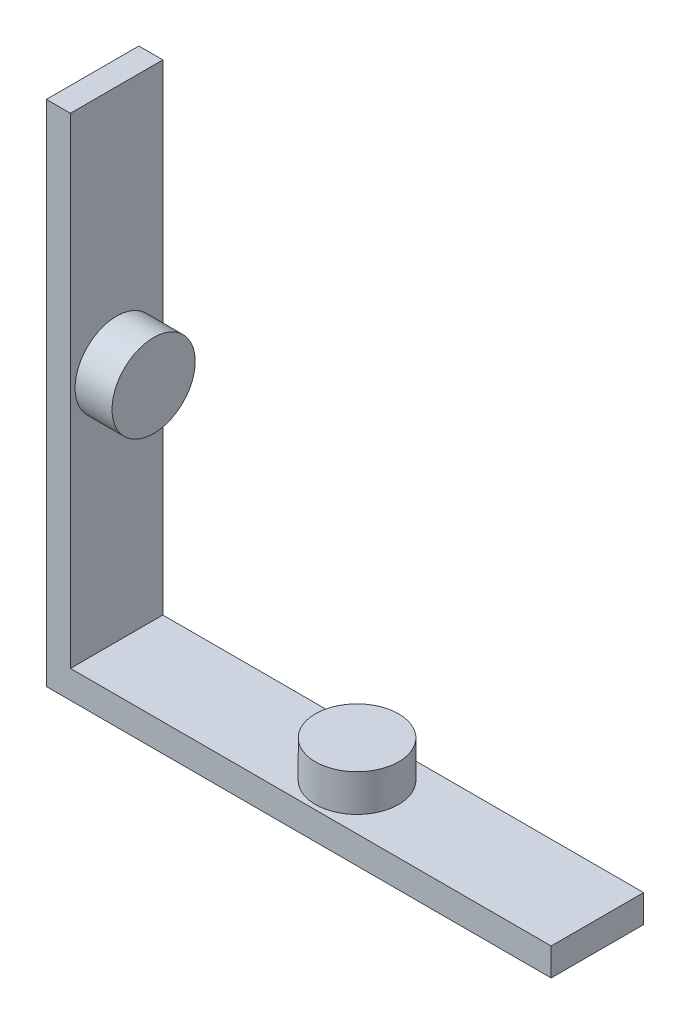
ISO-10303-21;
HEADER;
FILE_DESCRIPTION(('STEP AP214'),'2;1');
FILE_NAME('part.step','',(''),(''),'','','');
FILE_SCHEMA(('AUTOMOTIVE_DESIGN { 1 0 10303 214 1 1 1 1 }'));
ENDSEC;
DATA;
#1=APPLICATION_CONTEXT('core data for automotive mechanical design processes');
#2=APPLICATION_PROTOCOL_DEFINITION('international standard','automotive_design',2000,#1);
#3=PRODUCT_CONTEXT('',#1,'mechanical');
#4=PRODUCT('Part','Part','',(#3));
#5=PRODUCT_RELATED_PRODUCT_CATEGORY('part','',(#4));
#6=PRODUCT_DEFINITION_FORMATION('','',#4);
#7=PRODUCT_DEFINITION_CONTEXT('part definition',#1,'design');
#8=PRODUCT_DEFINITION('design','',#6,#7);
#9=PRODUCT_DEFINITION_SHAPE('','',#8);
#10=(LENGTH_UNIT() NAMED_UNIT(*) SI_UNIT(.MILLI.,.METRE.));
#11=(NAMED_UNIT(*) PLANE_ANGLE_UNIT() SI_UNIT($,.RADIAN.));
#12=(NAMED_UNIT(*) SI_UNIT($,.STERADIAN.) SOLID_ANGLE_UNIT());
#13=UNCERTAINTY_MEASURE_WITH_UNIT(LENGTH_MEASURE(1.E-05),#10,'distance_accuracy_value','');
#14=(GEOMETRIC_REPRESENTATION_CONTEXT(3) GLOBAL_UNCERTAINTY_ASSIGNED_CONTEXT((#13)) GLOBAL_UNIT_ASSIGNED_CONTEXT((#10,
#11,#12)) REPRESENTATION_CONTEXT('',''));
#15=CARTESIAN_POINT('',(0.,0.,0.));
#16=DIRECTION('',(0.,0.,1.));
#17=DIRECTION('',(1.,0.,0.));
#18=AXIS2_PLACEMENT_3D('',#15,#16,#17);
#19=CARTESIAN_POINT('',(15.,275.,50.));
#20=DIRECTION('',(0.,-1.,0.));
#21=DIRECTION('',(0.,0.,-1.));
#22=AXIS2_PLACEMENT_3D('',#19,#20,#21);
#23=PLANE('',#22);
#24=DIRECTION('',(-1.,0.,0.));
#25=VECTOR('',#24,1.);
#26=CARTESIAN_POINT('',(15.,275.,0.));
#27=LINE('',#26,#25);
#28=CARTESIAN_POINT('',(15.,275.,0.));
#29=VERTEX_POINT('',#28);
#30=CARTESIAN_POINT('',(2.00000000000006,275.,0.));
#31=VERTEX_POINT('',#30);
#32=EDGE_CURVE('E131',#29,#31,#27,.T.);
#33=ORIENTED_EDGE('',*,*,#32,.T.);
#34=DIRECTION('',(0.,0.,1.));
#35=VECTOR('',#34,1.);
#36=CARTESIAN_POINT('',(2.00000000000006,275.,50.));
#37=LINE('',#36,#35);
#38=CARTESIAN_POINT('',(2.00000000000006,275.,50.));
#39=VERTEX_POINT('',#38);
#40=EDGE_CURVE('E60',#31,#39,#37,.T.);
#41=ORIENTED_EDGE('',*,*,#40,.T.);
#42=DIRECTION('',(-1.,0.,0.));
#43=VECTOR('',#42,1.);
#44=CARTESIAN_POINT('',(15.,275.,50.));
#45=LINE('',#44,#43);
#46=CARTESIAN_POINT('',(15.,275.,50.));
#47=VERTEX_POINT('',#46);
#48=EDGE_CURVE('E108',#47,#39,#45,.T.);
#49=ORIENTED_EDGE('',*,*,#48,.F.);
#50=DIRECTION('',(0.,0.,-1.));
#51=VECTOR('',#50,1.);
#52=CARTESIAN_POINT('',(15.,275.,50.));
#53=LINE('',#52,#51);
#54=EDGE_CURVE('E130',#47,#29,#53,.T.);
#55=ORIENTED_EDGE('',*,*,#54,.T.);
#56=EDGE_LOOP('',(#33,#41,#49,#55));
#57=FACE_BOUND('',#56,.T.);
#58=ADVANCED_FACE('F35',(#57),#23,.F.);
#59=CARTESIAN_POINT('',(0.,275.,50.));
#60=DIRECTION('',(1.,0.,0.));
#61=DIRECTION('',(0.,1.,0.));
#62=AXIS2_PLACEMENT_3D('',#59,#60,#61);
#63=PLANE('',#62);
#64=DIRECTION('',(0.,0.,-1.));
#65=VECTOR('',#64,1.);
#66=CARTESIAN_POINT('',(0.,273.,50.));
#67=LINE('',#66,#65);
#68=CARTESIAN_POINT('',(0.,273.,48.));
#69=VERTEX_POINT('',#68);
#70=CARTESIAN_POINT('',(0.,273.,2.));
#71=VERTEX_POINT('',#70);
#72=EDGE_CURVE('E156',#69,#71,#67,.T.);
#73=ORIENTED_EDGE('',*,*,#72,.T.);
#74=DIRECTION('',(0.,-1.,0.));
#75=VECTOR('',#74,1.);
#76=CARTESIAN_POINT('',(0.,275.,2.));
#77=LINE('',#76,#75);
#78=CARTESIAN_POINT('',(0.,2.,2.));
#79=VERTEX_POINT('',#78);
#80=EDGE_CURVE('E158',#71,#79,#77,.T.);
#81=ORIENTED_EDGE('',*,*,#80,.T.);
#82=DIRECTION('',(0.,0.,1.));
#83=VECTOR('',#82,1.);
#84=CARTESIAN_POINT('',(0.,2.,50.));
#85=LINE('',#84,#83);
#86=CARTESIAN_POINT('',(0.,2.,48.));
#87=VERTEX_POINT('',#86);
#88=EDGE_CURVE('E152',#79,#87,#85,.T.);
#89=ORIENTED_EDGE('',*,*,#88,.T.);
#90=DIRECTION('',(0.,1.,0.));
#91=VECTOR('',#90,1.);
#92=CARTESIAN_POINT('',(0.,275.,48.));
#93=LINE('',#92,#91);
#94=EDGE_CURVE('E154',#87,#69,#93,.T.);
#95=ORIENTED_EDGE('',*,*,#94,.T.);
#96=EDGE_LOOP('',(#73,#81,#89,#95));
#97=FACE_BOUND('',#96,.T.);
#98=ADVANCED_FACE('F210',(#97),#63,.F.);
#99=CARTESIAN_POINT('',(0.,0.,50.));
#100=DIRECTION('',(0.,1.,0.));
#101=DIRECTION('',(0.,0.,1.));
#102=AXIS2_PLACEMENT_3D('',#99,#100,#101);
#103=PLANE('',#102);
#104=DIRECTION('',(1.,0.,0.));
#105=VECTOR('',#104,1.);
#106=CARTESIAN_POINT('',(0.,0.,50.));
#107=LINE('',#106,#105);
#108=CARTESIAN_POINT('',(2.00000000000006,0.,50.));
#109=VERTEX_POINT('',#108);
#110=CARTESIAN_POINT('',(275.,0.,50.));
#111=VERTEX_POINT('',#110);
#112=EDGE_CURVE('E100',#109,#111,#107,.T.);
#113=ORIENTED_EDGE('',*,*,#112,.F.);
#114=DIRECTION('',(0.,0.,-1.));
#115=VECTOR('',#114,1.);
#116=CARTESIAN_POINT('',(2.00000000000006,0.,50.));
#117=LINE('',#116,#115);
#118=CARTESIAN_POINT('',(2.00000000000006,0.,0.));
#119=VERTEX_POINT('',#118);
#120=EDGE_CURVE('E11',#109,#119,#117,.T.);
#121=ORIENTED_EDGE('',*,*,#120,.T.);
#122=DIRECTION('',(1.,0.,0.));
#123=VECTOR('',#122,1.);
#124=CARTESIAN_POINT('',(0.,0.,0.));
#125=LINE('',#124,#123);
#126=CARTESIAN_POINT('',(275.,0.,0.));
#127=VERTEX_POINT('',#126);
#128=EDGE_CURVE('E114',#119,#127,#125,.T.);
#129=ORIENTED_EDGE('',*,*,#128,.T.);
#130=DIRECTION('',(0.,0.,-1.));
#131=VECTOR('',#130,1.);
#132=CARTESIAN_POINT('',(275.,0.,50.));
#133=LINE('',#132,#131);
#134=EDGE_CURVE('E111',#111,#127,#133,.T.);
#135=ORIENTED_EDGE('',*,*,#134,.F.);
#136=EDGE_LOOP('',(#113,#121,#129,#135));
#137=FACE_BOUND('',#136,.T.);
#138=ADVANCED_FACE('F112',(#137),#103,.F.);
#139=CARTESIAN_POINT('',(275.,0.,50.));
#140=DIRECTION('',(-1.,0.,0.));
#141=DIRECTION('',(0.,0.,1.));
#142=AXIS2_PLACEMENT_3D('',#139,#140,#141);
#143=PLANE('',#142);
#144=DIRECTION('',(0.,1.,0.));
#145=VECTOR('',#144,1.);
#146=CARTESIAN_POINT('',(275.,0.,0.));
#147=LINE('',#146,#145);
#148=CARTESIAN_POINT('',(275.,15.,0.));
#149=VERTEX_POINT('',#148);
#150=EDGE_CURVE('E135',#127,#149,#147,.T.);
#151=ORIENTED_EDGE('',*,*,#150,.T.);
#152=DIRECTION('',(0.,0.,-1.));
#153=VECTOR('',#152,1.);
#154=CARTESIAN_POINT('',(275.,15.,50.));
#155=LINE('',#154,#153);
#156=CARTESIAN_POINT('',(275.,15.,50.));
#157=VERTEX_POINT('',#156);
#158=EDGE_CURVE('E118',#157,#149,#155,.T.);
#159=ORIENTED_EDGE('',*,*,#158,.F.);
#160=DIRECTION('',(0.,1.,0.));
#161=VECTOR('',#160,1.);
#162=CARTESIAN_POINT('',(275.,0.,50.));
#163=LINE('',#162,#161);
#164=EDGE_CURVE('E104',#111,#157,#163,.T.);
#165=ORIENTED_EDGE('',*,*,#164,.F.);
#166=ORIENTED_EDGE('',*,*,#134,.T.);
#167=EDGE_LOOP('',(#151,#159,#165,#166));
#168=FACE_BOUND('',#167,.T.);
#169=ADVANCED_FACE('F120',(#168),#143,.F.);
#170=CARTESIAN_POINT('',(275.,15.,50.));
#171=DIRECTION('',(0.,-1.,0.));
#172=DIRECTION('',(1.,0.,0.));
#173=AXIS2_PLACEMENT_3D('',#170,#171,#172);
#174=PLANE('',#173);
#175=CARTESIAN_POINT('',(145.,15.,25.));
#176=DIRECTION('',(0.,-1.,0.));
#177=DIRECTION('',(1.,0.,0.));
#178=AXIS2_PLACEMENT_3D('',#175,#176,#177);
#179=CIRCLE('',#178,22.5);
#180=CARTESIAN_POINT('',(167.5,15.,25.));
#181=VERTEX_POINT('',#180);
#182=EDGE_CURVE('E117',#181,#181,#179,.F.);
#183=ORIENTED_EDGE('',*,*,#182,.F.);
#184=EDGE_LOOP('',(#183));
#185=FACE_BOUND('',#184,.T.);
#186=DIRECTION('',(-1.,0.,0.));
#187=VECTOR('',#186,1.);
#188=CARTESIAN_POINT('',(275.,15.,0.));
#189=LINE('',#188,#187);
#190=CARTESIAN_POINT('',(15.,15.,0.));
#191=VERTEX_POINT('',#190);
#192=EDGE_CURVE('E137',#149,#191,#189,.T.);
#193=ORIENTED_EDGE('',*,*,#192,.T.);
#194=DIRECTION('',(0.,0.,-1.));
#195=VECTOR('',#194,1.);
#196=CARTESIAN_POINT('',(15.,15.,50.));
#197=LINE('',#196,#195);
#198=CARTESIAN_POINT('',(15.,15.,50.));
#199=VERTEX_POINT('',#198);
#200=EDGE_CURVE('E143',#199,#191,#197,.T.);
#201=ORIENTED_EDGE('',*,*,#200,.F.);
#202=DIRECTION('',(-1.,0.,0.));
#203=VECTOR('',#202,1.);
#204=CARTESIAN_POINT('',(275.,15.,50.));
#205=LINE('',#204,#203);
#206=EDGE_CURVE('E123',#157,#199,#205,.T.);
#207=ORIENTED_EDGE('',*,*,#206,.F.);
#208=ORIENTED_EDGE('',*,*,#158,.T.);
#209=EDGE_LOOP('',(#193,#201,#207,#208));
#210=FACE_BOUND('',#209,.T.);
#211=ADVANCED_FACE('F315',(#185,#210),#174,.F.);
#212=CARTESIAN_POINT('',(15.,15.,50.));
#213=DIRECTION('',(-1.,0.,0.));
#214=DIRECTION('',(0.,0.,1.));
#215=AXIS2_PLACEMENT_3D('',#212,#213,#214);
#216=PLANE('',#215);
#217=CARTESIAN_POINT('',(15.,145.,25.));
#218=DIRECTION('',(-1.,0.,0.));
#219=DIRECTION('',(0.,0.,1.));
#220=AXIS2_PLACEMENT_3D('',#217,#218,#219);
#221=CIRCLE('',#220,22.5);
#222=CARTESIAN_POINT('',(15.,145.,47.5));
#223=VERTEX_POINT('',#222);
#224=EDGE_CURVE('E149',#223,#223,#221,.F.);
#225=ORIENTED_EDGE('',*,*,#224,.F.);
#226=EDGE_LOOP('',(#225));
#227=FACE_BOUND('',#226,.T.);
#228=DIRECTION('',(0.,1.,0.));
#229=VECTOR('',#228,1.);
#230=CARTESIAN_POINT('',(15.,15.,0.));
#231=LINE('',#230,#229);
#232=EDGE_CURVE('E139',#191,#29,#231,.T.);
#233=ORIENTED_EDGE('',*,*,#232,.T.);
#234=ORIENTED_EDGE('',*,*,#54,.F.);
#235=DIRECTION('',(0.,1.,0.));
#236=VECTOR('',#235,1.);
#237=CARTESIAN_POINT('',(15.,15.,50.));
#238=LINE('',#237,#236);
#239=EDGE_CURVE('E125',#199,#47,#238,.T.);
#240=ORIENTED_EDGE('',*,*,#239,.F.);
#241=ORIENTED_EDGE('',*,*,#200,.T.);
#242=EDGE_LOOP('',(#233,#234,#240,#241));
#243=FACE_BOUND('',#242,.T.);
#244=ADVANCED_FACE('F268',(#227,#243),#216,.F.);
#245=CARTESIAN_POINT('',(0.,0.,50.));
#246=DIRECTION('',(0.,0.,1.));
#247=DIRECTION('',(1.,0.,0.));
#248=AXIS2_PLACEMENT_3D('',#245,#246,#247);
#249=PLANE('',#248);
#250=ORIENTED_EDGE('',*,*,#48,.T.);
#251=DIRECTION('',(0.,-1.,0.));
#252=VECTOR('',#251,1.);
#253=CARTESIAN_POINT('',(2.00000000000006,0.,50.));
#254=LINE('',#253,#252);
#255=EDGE_CURVE('E45',#39,#109,#254,.T.);
#256=ORIENTED_EDGE('',*,*,#255,.T.);
#257=ORIENTED_EDGE('',*,*,#112,.T.);
#258=ORIENTED_EDGE('',*,*,#164,.T.);
#259=ORIENTED_EDGE('',*,*,#206,.T.);
#260=ORIENTED_EDGE('',*,*,#239,.T.);
#261=EDGE_LOOP('',(#250,#256,#257,#258,#259,#260));
#262=FACE_BOUND('',#261,.T.);
#263=ADVANCED_FACE('F102',(#262),#249,.T.);
#264=CARTESIAN_POINT('',(0.,0.,0.));
#265=DIRECTION('',(0.,0.,1.));
#266=DIRECTION('',(1.,0.,0.));
#267=AXIS2_PLACEMENT_3D('',#264,#265,#266);
#268=PLANE('',#267);
#269=ORIENTED_EDGE('',*,*,#128,.F.);
#270=DIRECTION('',(0.,1.,0.));
#271=VECTOR('',#270,1.);
#272=CARTESIAN_POINT('',(2.00000000000006,0.,0.));
#273=LINE('',#272,#271);
#274=EDGE_CURVE('E161',#119,#31,#273,.T.);
#275=ORIENTED_EDGE('',*,*,#274,.T.);
#276=ORIENTED_EDGE('',*,*,#32,.F.);
#277=ORIENTED_EDGE('',*,*,#232,.F.);
#278=ORIENTED_EDGE('',*,*,#192,.F.);
#279=ORIENTED_EDGE('',*,*,#150,.F.);
#280=EDGE_LOOP('',(#269,#275,#276,#277,#278,#279));
#281=FACE_BOUND('',#280,.T.);
#282=ADVANCED_FACE('F193',(#281),#268,.F.);
#283=CARTESIAN_POINT('',(145.,35.,25.));
#284=DIRECTION('',(0.,-1.,0.));
#285=DIRECTION('',(1.,0.,0.));
#286=AXIS2_PLACEMENT_3D('',#283,#284,#285);
#287=CYLINDRICAL_SURFACE('',#286,22.5);
#288=CARTESIAN_POINT('',(145.,35.,25.));
#289=DIRECTION('',(0.,1.,0.));
#290=DIRECTION('',(-1.,0.,0.));
#291=AXIS2_PLACEMENT_3D('',#288,#289,#290);
#292=CIRCLE('',#291,22.5);
#293=CARTESIAN_POINT('',(122.5,35.,25.));
#294=VERTEX_POINT('',#293);
#295=EDGE_CURVE('E133',#294,#294,#292,.T.);
#296=ORIENTED_EDGE('',*,*,#295,.F.);
#297=EDGE_LOOP('',(#296));
#298=FACE_BOUND('',#297,.T.);
#299=ORIENTED_EDGE('',*,*,#182,.T.);
#300=EDGE_LOOP('',(#299));
#301=FACE_BOUND('',#300,.T.);
#302=ADVANCED_FACE('F257',(#298,#301),#287,.T.);
#303=CARTESIAN_POINT('',(145.,35.,25.));
#304=DIRECTION('',(0.,1.,0.));
#305=DIRECTION('',(-1.,0.,0.));
#306=AXIS2_PLACEMENT_3D('',#303,#304,#305);
#307=PLANE('',#306);
#308=ORIENTED_EDGE('',*,*,#295,.T.);
#309=EDGE_LOOP('',(#308));
#310=FACE_BOUND('',#309,.T.);
#311=ADVANCED_FACE('F305',(#310),#307,.T.);
#312=CARTESIAN_POINT('',(35.,145.,25.));
#313=DIRECTION('',(-1.,0.,0.));
#314=DIRECTION('',(0.,-1.,0.));
#315=AXIS2_PLACEMENT_3D('',#312,#313,#314);
#316=CYLINDRICAL_SURFACE('',#315,22.5);
#317=CARTESIAN_POINT('',(35.,145.,25.));
#318=DIRECTION('',(1.,0.,0.));
#319=DIRECTION('',(0.,1.,0.));
#320=AXIS2_PLACEMENT_3D('',#317,#318,#319);
#321=CIRCLE('',#320,22.5);
#322=CARTESIAN_POINT('',(35.,167.5,25.));
#323=VERTEX_POINT('',#322);
#324=EDGE_CURVE('E175',#323,#323,#321,.T.);
#325=ORIENTED_EDGE('',*,*,#324,.F.);
#326=EDGE_LOOP('',(#325));
#327=FACE_BOUND('',#326,.T.);
#328=ORIENTED_EDGE('',*,*,#224,.T.);
#329=EDGE_LOOP('',(#328));
#330=FACE_BOUND('',#329,.T.);
#331=ADVANCED_FACE('F296',(#327,#330),#316,.T.);
#332=CARTESIAN_POINT('',(35.,145.,25.));
#333=DIRECTION('',(1.,0.,0.));
#334=DIRECTION('',(0.,1.,0.));
#335=AXIS2_PLACEMENT_3D('',#332,#333,#334);
#336=PLANE('',#335);
#337=ORIENTED_EDGE('',*,*,#324,.T.);
#338=EDGE_LOOP('',(#337));
#339=FACE_BOUND('',#338,.T.);
#340=ADVANCED_FACE('F207',(#339),#336,.T.);
#341=CARTESIAN_POINT('',(2.00000000000006,0.,50.));
#342=DIRECTION('',(-0.707106781186538,0.,0.707106781186557));
#343=DIRECTION('',(0.,1.,0.));
#344=AXIS2_PLACEMENT_3D('',#341,#342,#343);
#345=PLANE('',#344);
#346=DIRECTION('',(0.577350269189637,-0.57735026918962,0.57735026918962));
#347=VECTOR('',#346,1.);
#348=CARTESIAN_POINT('',(2.00000000000006,0.,50.));
#349=LINE('',#348,#347);
#350=EDGE_CURVE('E169',#109,#87,#349,.F.);
#351=ORIENTED_EDGE('',*,*,#350,.F.);
#352=ORIENTED_EDGE('',*,*,#255,.F.);
#353=DIRECTION('',(0.577350269189636,0.57735026918962,0.57735026918962));
#354=VECTOR('',#353,1.);
#355=CARTESIAN_POINT('',(-89.6666666666675,183.333333333335,-41.666666666665));
#356=LINE('',#355,#354);
#357=EDGE_CURVE('E40',#69,#39,#356,.T.);
#358=ORIENTED_EDGE('',*,*,#357,.F.);
#359=ORIENTED_EDGE('',*,*,#94,.F.);
#360=EDGE_LOOP('',(#351,#352,#358,#359));
#361=FACE_BOUND('',#360,.T.);
#362=ADVANCED_FACE('F38',(#361),#345,.T.);
#363=CARTESIAN_POINT('',(0.,273.,50.));
#364=DIRECTION('',(0.707106781186538,-0.707106781186557,0.));
#365=DIRECTION('',(0.,0.,-1.));
#366=AXIS2_PLACEMENT_3D('',#363,#364,#365);
#367=PLANE('',#366);
#368=ORIENTED_EDGE('',*,*,#357,.T.);
#369=ORIENTED_EDGE('',*,*,#40,.F.);
#370=DIRECTION('',(-0.577350269189636,-0.57735026918962,0.57735026918962));
#371=VECTOR('',#370,1.);
#372=CARTESIAN_POINT('',(-16.0000000000001,257.,17.9999999999997));
#373=LINE('',#372,#371);
#374=EDGE_CURVE('E168',#71,#31,#373,.F.);
#375=ORIENTED_EDGE('',*,*,#374,.F.);
#376=ORIENTED_EDGE('',*,*,#72,.F.);
#377=EDGE_LOOP('',(#368,#369,#375,#376));
#378=FACE_BOUND('',#377,.T.);
#379=ADVANCED_FACE('F200',(#378),#367,.F.);
#380=CARTESIAN_POINT('',(2.00000000000006,0.,50.));
#381=DIRECTION('',(0.707106781186538,0.707106781186557,0.));
#382=DIRECTION('',(0.,0.,-1.));
#383=AXIS2_PLACEMENT_3D('',#380,#381,#382);
#384=PLANE('',#383);
#385=ORIENTED_EDGE('',*,*,#350,.T.);
#386=ORIENTED_EDGE('',*,*,#88,.F.);
#387=DIRECTION('',(0.577350269189637,-0.57735026918962,-0.57735026918962));
#388=VECTOR('',#387,1.);
#389=CARTESIAN_POINT('',(-14.6666666666668,16.6666666666664,16.6666666666664));
#390=LINE('',#389,#388);
#391=EDGE_CURVE('E166',#119,#79,#390,.F.);
#392=ORIENTED_EDGE('',*,*,#391,.F.);
#393=ORIENTED_EDGE('',*,*,#120,.F.);
#394=EDGE_LOOP('',(#385,#386,#392,#393));
#395=FACE_BOUND('',#394,.T.);
#396=ADVANCED_FACE('F190',(#395),#384,.F.);
#397=CARTESIAN_POINT('',(0.,275.,2.));
#398=DIRECTION('',(0.707106781186538,0.,0.707106781186557));
#399=DIRECTION('',(0.,-1.,0.));
#400=AXIS2_PLACEMENT_3D('',#397,#398,#399);
#401=PLANE('',#400);
#402=ORIENTED_EDGE('',*,*,#374,.T.);
#403=ORIENTED_EDGE('',*,*,#274,.F.);
#404=ORIENTED_EDGE('',*,*,#391,.T.);
#405=ORIENTED_EDGE('',*,*,#80,.F.);
#406=EDGE_LOOP('',(#402,#403,#404,#405));
#407=FACE_BOUND('',#406,.T.);
#408=ADVANCED_FACE('F197',(#407),#401,.F.);
#409=CLOSED_SHELL('',(#58,#98,#138,#169,#211,#244,#263,#282,#302,#311,#331,#340,#362,#379,#396,#408));
#410=MANIFOLD_SOLID_BREP('B2',#409);
#411=ADVANCED_BREP_SHAPE_REPRESENTATION('',(#18,#410),#14);
#412=SHAPE_DEFINITION_REPRESENTATION(#9,#411);
ENDSEC;
END-ISO-10303-21;
